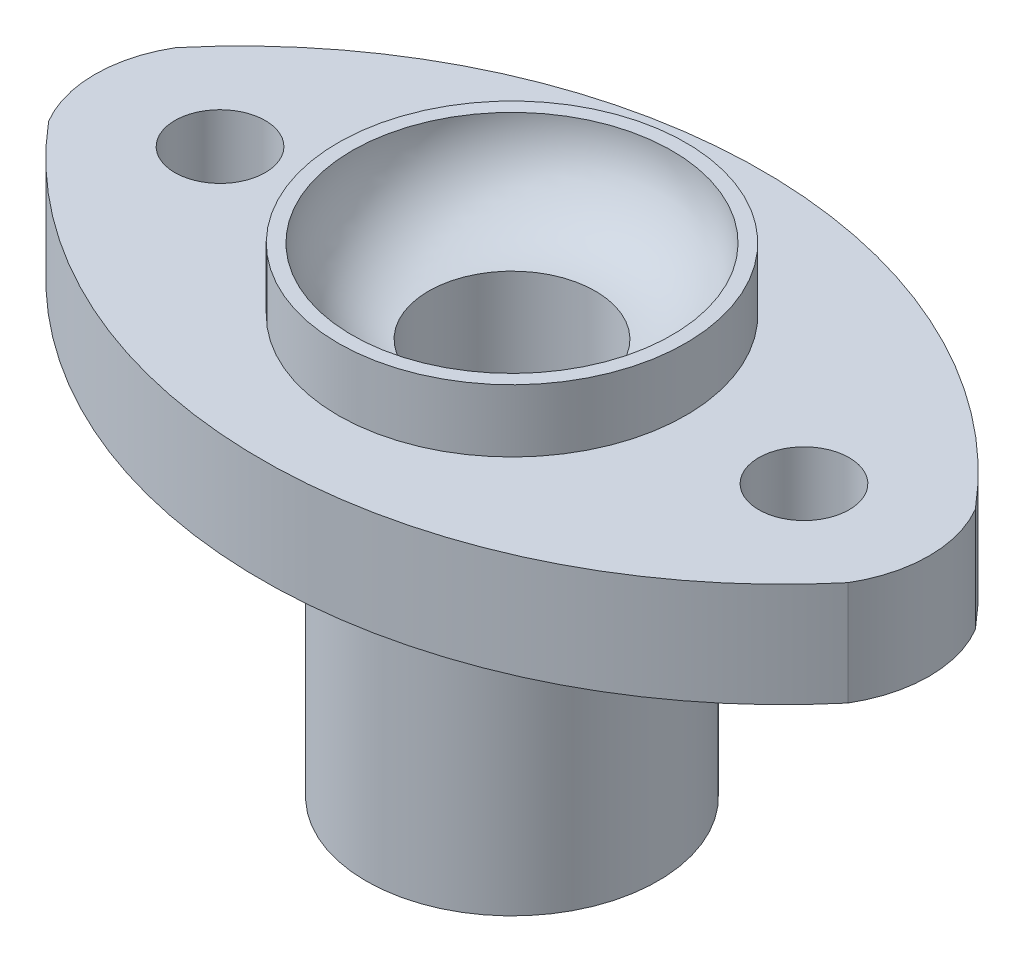
ISO-10303-21;
HEADER;
FILE_DESCRIPTION(('STEP AP214'),'2;1');
FILE_NAME('part.step','',(''),(''),'','','');
FILE_SCHEMA(('AUTOMOTIVE_DESIGN { 1 0 10303 214 1 1 1 1 }'));
ENDSEC;
DATA;
#1=APPLICATION_CONTEXT('core data for automotive mechanical design processes');
#2=APPLICATION_PROTOCOL_DEFINITION('international standard','automotive_design',2000,#1);
#3=PRODUCT_CONTEXT('',#1,'mechanical');
#4=PRODUCT('Part','Part','',(#3));
#5=PRODUCT_RELATED_PRODUCT_CATEGORY('part','',(#4));
#6=PRODUCT_DEFINITION_FORMATION('','',#4);
#7=PRODUCT_DEFINITION_CONTEXT('part definition',#1,'design');
#8=PRODUCT_DEFINITION('design','',#6,#7);
#9=PRODUCT_DEFINITION_SHAPE('','',#8);
#10=(LENGTH_UNIT() NAMED_UNIT(*) SI_UNIT(.MILLI.,.METRE.));
#11=(NAMED_UNIT(*) PLANE_ANGLE_UNIT() SI_UNIT($,.RADIAN.));
#12=(NAMED_UNIT(*) SI_UNIT($,.STERADIAN.) SOLID_ANGLE_UNIT());
#13=UNCERTAINTY_MEASURE_WITH_UNIT(LENGTH_MEASURE(1.E-05),#10,'distance_accuracy_value','');
#14=(GEOMETRIC_REPRESENTATION_CONTEXT(3) GLOBAL_UNCERTAINTY_ASSIGNED_CONTEXT((#13)) GLOBAL_UNIT_ASSIGNED_CONTEXT((#10,
#11,#12)) REPRESENTATION_CONTEXT('',''));
#15=CARTESIAN_POINT('',(0.,0.,0.));
#16=DIRECTION('',(0.,0.,1.));
#17=DIRECTION('',(1.,0.,0.));
#18=AXIS2_PLACEMENT_3D('',#15,#16,#17);
#19=CARTESIAN_POINT('',(0.,45.,0.));
#20=DIRECTION('',(0.,-1.,0.));
#21=DIRECTION('',(0.,0.,-1.));
#22=AXIS2_PLACEMENT_3D('',#19,#20,#21);
#23=CYLINDRICAL_SURFACE('',#22,21.);
#24=CARTESIAN_POINT('',(0.,45.,0.));
#25=DIRECTION('',(0.,1.,0.));
#26=DIRECTION('',(0.,0.,1.));
#27=AXIS2_PLACEMENT_3D('',#24,#25,#26);
#28=CIRCLE('',#27,21.);
#29=CARTESIAN_POINT('',(0.,45.,-21.));
#30=VERTEX_POINT('',#29);
#31=EDGE_CURVE('E133',#30,#30,#28,.T.);
#32=CARTESIAN_POINT('',(0.,0.,0.));
#33=DIRECTION('',(0.,1.,0.));
#34=DIRECTION('',(0.,0.,1.));
#35=AXIS2_PLACEMENT_3D('',#32,#33,#34);
#36=CIRCLE('',#35,21.);
#37=CARTESIAN_POINT('',(0.,0.,-21.));
#38=VERTEX_POINT('',#37);
#39=EDGE_CURVE('E132',#38,#38,#36,.T.);
#40=CARTESIAN_POINT('',(0.,45.,-21.));
#41=CARTESIAN_POINT('',(0.,44.53125,-21.));
#42=CARTESIAN_POINT('',(0.,44.0625,-21.));
#43=CARTESIAN_POINT('',(0.,43.125,-21.));
#44=CARTESIAN_POINT('',(0.,42.65625,-21.));
#45=CARTESIAN_POINT('',(0.,41.71875,-21.));
#46=CARTESIAN_POINT('',(0.,41.25,-21.));
#47=CARTESIAN_POINT('',(0.,40.3125,-21.));
#48=CARTESIAN_POINT('',(0.,39.84375,-21.));
#49=CARTESIAN_POINT('',(0.,38.90625,-21.));
#50=CARTESIAN_POINT('',(0.,38.4375,-21.));
#51=CARTESIAN_POINT('',(0.,37.5,-21.));
#52=CARTESIAN_POINT('',(0.,37.03125,-21.));
#53=CARTESIAN_POINT('',(0.,36.09375,-21.));
#54=CARTESIAN_POINT('',(0.,35.625,-21.));
#55=CARTESIAN_POINT('',(0.,34.6875,-21.));
#56=CARTESIAN_POINT('',(0.,34.21875,-21.));
#57=CARTESIAN_POINT('',(0.,33.28125,-21.));
#58=CARTESIAN_POINT('',(0.,32.8125,-21.));
#59=CARTESIAN_POINT('',(0.,31.875,-21.));
#60=CARTESIAN_POINT('',(0.,31.40625,-21.));
#61=CARTESIAN_POINT('',(0.,30.46875,-21.));
#62=CARTESIAN_POINT('',(0.,30.,-21.));
#63=CARTESIAN_POINT('',(0.,29.0625,-21.));
#64=CARTESIAN_POINT('',(0.,28.59375,-21.));
#65=CARTESIAN_POINT('',(0.,27.65625,-21.));
#66=CARTESIAN_POINT('',(0.,27.1875,-21.));
#67=CARTESIAN_POINT('',(0.,26.25,-21.));
#68=CARTESIAN_POINT('',(0.,25.78125,-21.));
#69=CARTESIAN_POINT('',(0.,24.84375,-21.));
#70=CARTESIAN_POINT('',(0.,24.375,-21.));
#71=CARTESIAN_POINT('',(0.,23.4375,-21.));
#72=CARTESIAN_POINT('',(0.,22.96875,-21.));
#73=CARTESIAN_POINT('',(0.,22.03125,-21.));
#74=CARTESIAN_POINT('',(0.,21.5625,-21.));
#75=CARTESIAN_POINT('',(0.,20.625,-21.));
#76=CARTESIAN_POINT('',(0.,20.15625,-21.));
#77=CARTESIAN_POINT('',(0.,19.21875,-21.));
#78=CARTESIAN_POINT('',(0.,18.75,-21.));
#79=CARTESIAN_POINT('',(0.,17.8125,-21.));
#80=CARTESIAN_POINT('',(0.,17.34375,-21.));
#81=CARTESIAN_POINT('',(0.,16.40625,-21.));
#82=CARTESIAN_POINT('',(0.,15.9375,-21.));
#83=CARTESIAN_POINT('',(0.,15.,-21.));
#84=CARTESIAN_POINT('',(0.,14.53125,-21.));
#85=CARTESIAN_POINT('',(0.,13.59375,-21.));
#86=CARTESIAN_POINT('',(0.,13.125,-21.));
#87=CARTESIAN_POINT('',(0.,12.1875,-21.));
#88=CARTESIAN_POINT('',(0.,11.71875,-21.));
#89=CARTESIAN_POINT('',(0.,10.78125,-21.));
#90=CARTESIAN_POINT('',(0.,10.3125,-21.));
#91=CARTESIAN_POINT('',(0.,9.375,-21.));
#92=CARTESIAN_POINT('',(0.,8.90625,-21.));
#93=CARTESIAN_POINT('',(0.,7.96874999999999,-21.));
#94=CARTESIAN_POINT('',(0.,7.5,-21.));
#95=CARTESIAN_POINT('',(0.,6.5625,-21.));
#96=CARTESIAN_POINT('',(0.,6.09375,-21.));
#97=CARTESIAN_POINT('',(0.,5.15625,-21.));
#98=CARTESIAN_POINT('',(0.,4.68749999999999,-21.));
#99=CARTESIAN_POINT('',(0.,3.74999999999999,-21.));
#100=CARTESIAN_POINT('',(0.,3.28124999999999,-21.));
#101=CARTESIAN_POINT('',(0.,2.34374999999999,-21.));
#102=CARTESIAN_POINT('',(0.,1.87499999999999,-21.));
#103=CARTESIAN_POINT('',(0.,0.937499999999992,-21.));
#104=CARTESIAN_POINT('',(0.,0.468749999999993,-21.));
#105=CARTESIAN_POINT('',(0.,0.,-21.));
#106=B_SPLINE_CURVE_WITH_KNOTS('',3,(#40,#41,#42,#43,#44,#45,#46,#47,#48,#49,#50,#51,#52,#53,
#54,#55,#56,#57,#58,#59,#60,#61,#62,#63,#64,#65,#66,#67,#68,#69,#70,#71,#72,#73,#74,#75,#76,#77,
#78,#79,#80,#81,#82,#83,#84,#85,#86,#87,#88,#89,#90,#91,#92,#93,#94,#95,#96,#97,#98,#99,#100,
#101,#102,#103,#104,#105),.UNSPECIFIED.,.F.,.F.,(4,2,2,2,2,2,2,2,2,2,2,2,2,2,2,2,2,2,2,2,2,2,2,
2,2,2,2,2,2,2,2,2,4),(0.,1.40625,2.8125,4.21875000000001,5.62500000000001,7.03125,8.4375,
9.84375000000001,11.25,12.65625,14.0625,15.46875,16.875,18.28125,19.6875,21.09375,22.5,23.90625,
25.3125,26.71875,28.125,29.53125,30.9375,32.34375,33.75,35.15625,36.5625,37.96875,39.375,
40.78125,42.1875,43.59375,45.),.UNSPECIFIED.);
#107=EDGE_CURVE('BSEAM40',#30,#38,#106,.T.);
#108=ORIENTED_EDGE('',*,*,#31,.F.);
#109=ORIENTED_EDGE('',*,*,#39,.T.);
#110=ORIENTED_EDGE('',*,*,#107,.T.);
#111=ORIENTED_EDGE('',*,*,#107,.F.);
#112=EDGE_LOOP('',(#108,#110,#109,#111));
#113=FACE_BOUND('',#112,.T.);
#114=ADVANCED_FACE('F40',(#113),#23,.T.);
#115=CARTESIAN_POINT('',(0.,0.,0.));
#116=DIRECTION('',(0.,1.,0.));
#117=DIRECTION('',(0.,0.,1.));
#118=AXIS2_PLACEMENT_3D('',#115,#116,#117);
#119=PLANE('',#118);
#120=CARTESIAN_POINT('',(0.,0.,0.));
#121=DIRECTION('',(0.,1.,0.));
#122=DIRECTION('',(0.,0.,1.));
#123=AXIS2_PLACEMENT_3D('',#120,#121,#122);
#124=CIRCLE('',#123,14.5000000000001);
#125=CARTESIAN_POINT('',(0.,0.,14.5000000000001));
#126=VERTEX_POINT('',#125);
#127=EDGE_CURVE('E11',#126,#126,#124,.T.);
#128=ORIENTED_EDGE('',*,*,#127,.T.);
#129=EDGE_LOOP('',(#128));
#130=FACE_BOUND('',#129,.T.);
#131=ORIENTED_EDGE('',*,*,#39,.F.);
#132=EDGE_LOOP('',(#131));
#133=FACE_BOUND('',#132,.T.);
#134=ADVANCED_FACE('F204',(#130,#133),#119,.F.);
#135=CARTESIAN_POINT('',(-21.,60.,-19.5));
#136=DIRECTION('',(0.,-1.,0.));
#137=DIRECTION('',(0.,0.,-1.));
#138=AXIS2_PLACEMENT_3D('',#135,#136,#137);
#139=PLANE('',#138);
#140=CARTESIAN_POINT('',(0.,60.,0.));
#141=DIRECTION('',(0.,1.,0.));
#142=DIRECTION('',(0.,0.,1.));
#143=AXIS2_PLACEMENT_3D('',#140,#141,#142);
#144=CIRCLE('',#143,25.);
#145=CARTESIAN_POINT('',(0.,60.,25.));
#146=VERTEX_POINT('',#145);
#147=EDGE_CURVE('E137',#146,#146,#144,.T.);
#148=ORIENTED_EDGE('',*,*,#147,.F.);
#149=EDGE_LOOP('',(#148));
#150=FACE_BOUND('',#149,.T.);
#151=CARTESIAN_POINT('',(0.,60.,-39.));
#152=DIRECTION('',(0.,1.,0.));
#153=DIRECTION('',(0.,0.,-1.));
#154=AXIS2_PLACEMENT_3D('',#151,#152,#153);
#155=CIRCLE('',#154,75.);
#156=CARTESIAN_POINT('',(-57.49619544665,60.,9.15794336514615));
#157=VERTEX_POINT('',#156);
#158=CARTESIAN_POINT('',(57.49619544665,60.,9.15794336514614));
#159=VERTEX_POINT('',#158);
#160=EDGE_CURVE('E96',#157,#159,#155,.T.);
#161=ORIENTED_EDGE('',*,*,#160,.T.);
#162=CARTESIAN_POINT('',(42.,60.,0.));
#163=DIRECTION('',(0.,1.,0.));
#164=DIRECTION('',(0.,0.,1.));
#165=AXIS2_PLACEMENT_3D('',#162,#163,#164);
#166=CIRCLE('',#165,18.);
#167=CARTESIAN_POINT('',(57.49619544665,60.,-9.15794336514614));
#168=VERTEX_POINT('',#167);
#169=EDGE_CURVE('E90',#159,#168,#166,.T.);
#170=ORIENTED_EDGE('',*,*,#169,.T.);
#171=CARTESIAN_POINT('',(0.,60.,39.));
#172=DIRECTION('',(0.,1.,0.));
#173=DIRECTION('',(0.,0.,1.));
#174=AXIS2_PLACEMENT_3D('',#171,#172,#173);
#175=CIRCLE('',#174,75.);
#176=CARTESIAN_POINT('',(-57.49619544665,60.,-9.15794336514612));
#177=VERTEX_POINT('',#176);
#178=EDGE_CURVE('E94',#168,#177,#175,.T.);
#179=ORIENTED_EDGE('',*,*,#178,.T.);
#180=CARTESIAN_POINT('',(-42.,60.,0.));
#181=DIRECTION('',(0.,1.,0.));
#182=DIRECTION('',(0.,0.,-1.));
#183=AXIS2_PLACEMENT_3D('',#180,#181,#182);
#184=CIRCLE('',#183,18.);
#185=EDGE_CURVE('E59',#177,#157,#184,.T.);
#186=ORIENTED_EDGE('',*,*,#185,.T.);
#187=EDGE_LOOP('',(#161,#170,#179,#186));
#188=FACE_BOUND('',#187,.T.);
#189=CARTESIAN_POINT('',(-42.,60.,0.));
#190=DIRECTION('',(0.,1.,0.));
#191=DIRECTION('',(0.,0.,1.));
#192=AXIS2_PLACEMENT_3D('',#189,#190,#191);
#193=CIRCLE('',#192,6.5);
#194=CARTESIAN_POINT('',(-42.,60.,6.5));
#195=VERTEX_POINT('',#194);
#196=EDGE_CURVE('E119',#195,#195,#193,.T.);
#197=ORIENTED_EDGE('',*,*,#196,.F.);
#198=EDGE_LOOP('',(#197));
#199=FACE_BOUND('',#198,.T.);
#200=CARTESIAN_POINT('',(42.,60.,0.));
#201=DIRECTION('',(0.,1.,0.));
#202=DIRECTION('',(0.,0.,-1.));
#203=AXIS2_PLACEMENT_3D('',#200,#201,#202);
#204=CIRCLE('',#203,6.5);
#205=CARTESIAN_POINT('',(42.,60.,-6.5));
#206=VERTEX_POINT('',#205);
#207=EDGE_CURVE('E153',#206,#206,#204,.T.);
#208=ORIENTED_EDGE('',*,*,#207,.F.);
#209=EDGE_LOOP('',(#208));
#210=FACE_BOUND('',#209,.T.);
#211=ADVANCED_FACE('F91',(#150,#188,#199,#210),#139,.F.);
#212=CARTESIAN_POINT('',(-21.,45.,-19.5));
#213=DIRECTION('',(0.,-1.,0.));
#214=DIRECTION('',(0.,0.,-1.));
#215=AXIS2_PLACEMENT_3D('',#212,#213,#214);
#216=PLANE('',#215);
#217=ORIENTED_EDGE('',*,*,#31,.T.);
#218=EDGE_LOOP('',(#217));
#219=FACE_BOUND('',#218,.T.);
#220=CARTESIAN_POINT('',(-42.,45.,0.));
#221=DIRECTION('',(0.,1.,0.));
#222=DIRECTION('',(0.,0.,1.));
#223=AXIS2_PLACEMENT_3D('',#220,#221,#222);
#224=CIRCLE('',#223,6.5);
#225=CARTESIAN_POINT('',(-42.,45.,6.5));
#226=VERTEX_POINT('',#225);
#227=EDGE_CURVE('E157',#226,#226,#224,.T.);
#228=ORIENTED_EDGE('',*,*,#227,.T.);
#229=EDGE_LOOP('',(#228));
#230=FACE_BOUND('',#229,.T.);
#231=CARTESIAN_POINT('',(0.,45.,-39.));
#232=DIRECTION('',(0.,1.,0.));
#233=DIRECTION('',(0.,0.,-1.));
#234=AXIS2_PLACEMENT_3D('',#231,#232,#233);
#235=CIRCLE('',#234,75.);
#236=CARTESIAN_POINT('',(-57.49619544665,45.,9.15794336514615));
#237=VERTEX_POINT('',#236);
#238=CARTESIAN_POINT('',(57.49619544665,45.,9.15794336514614));
#239=VERTEX_POINT('',#238);
#240=EDGE_CURVE('E115',#237,#239,#235,.T.);
#241=ORIENTED_EDGE('',*,*,#240,.F.);
#242=CARTESIAN_POINT('',(-42.,45.,0.));
#243=DIRECTION('',(0.,1.,0.));
#244=DIRECTION('',(0.,0.,-1.));
#245=AXIS2_PLACEMENT_3D('',#242,#243,#244);
#246=CIRCLE('',#245,18.);
#247=CARTESIAN_POINT('',(-57.49619544665,45.,-9.15794336514612));
#248=VERTEX_POINT('',#247);
#249=EDGE_CURVE('E82',#248,#237,#246,.T.);
#250=ORIENTED_EDGE('',*,*,#249,.F.);
#251=CARTESIAN_POINT('',(0.,45.,39.));
#252=DIRECTION('',(0.,1.,0.));
#253=DIRECTION('',(0.,0.,1.));
#254=AXIS2_PLACEMENT_3D('',#251,#252,#253);
#255=CIRCLE('',#254,75.);
#256=CARTESIAN_POINT('',(57.49619544665,45.,-9.15794336514614));
#257=VERTEX_POINT('',#256);
#258=EDGE_CURVE('E76',#257,#248,#255,.T.);
#259=ORIENTED_EDGE('',*,*,#258,.F.);
#260=CARTESIAN_POINT('',(42.,45.,0.));
#261=DIRECTION('',(0.,1.,0.));
#262=DIRECTION('',(0.,0.,1.));
#263=AXIS2_PLACEMENT_3D('',#260,#261,#262);
#264=CIRCLE('',#263,18.);
#265=EDGE_CURVE('E102',#239,#257,#264,.T.);
#266=ORIENTED_EDGE('',*,*,#265,.F.);
#267=EDGE_LOOP('',(#241,#250,#259,#266));
#268=FACE_BOUND('',#267,.T.);
#269=CARTESIAN_POINT('',(42.,45.,0.));
#270=DIRECTION('',(0.,1.,0.));
#271=DIRECTION('',(0.,0.,-1.));
#272=AXIS2_PLACEMENT_3D('',#269,#270,#271);
#273=CIRCLE('',#272,6.5);
#274=CARTESIAN_POINT('',(42.,45.,-6.5));
#275=VERTEX_POINT('',#274);
#276=EDGE_CURVE('E158',#275,#275,#273,.T.);
#277=ORIENTED_EDGE('',*,*,#276,.T.);
#278=EDGE_LOOP('',(#277));
#279=FACE_BOUND('',#278,.T.);
#280=ADVANCED_FACE('F217',(#219,#230,#268,#279),#216,.T.);
#281=CARTESIAN_POINT('',(0.,60.,-39.));
#282=DIRECTION('',(0.,-1.,0.));
#283=DIRECTION('',(0.,0.,-1.));
#284=AXIS2_PLACEMENT_3D('',#281,#282,#283);
#285=CYLINDRICAL_SURFACE('',#284,75.);
#286=ORIENTED_EDGE('',*,*,#240,.T.);
#287=DIRECTION('',(0.,-1.,0.));
#288=VECTOR('',#287,1.);
#289=CARTESIAN_POINT('',(57.49619544665,60.,9.15794336514614));
#290=LINE('',#289,#288);
#291=EDGE_CURVE('E104',#159,#239,#290,.T.);
#292=ORIENTED_EDGE('',*,*,#291,.F.);
#293=ORIENTED_EDGE('',*,*,#160,.F.);
#294=DIRECTION('',(0.,-1.,0.));
#295=VECTOR('',#294,1.);
#296=CARTESIAN_POINT('',(-57.49619544665,60.,9.15794336514615));
#297=LINE('',#296,#295);
#298=EDGE_CURVE('E111',#157,#237,#297,.T.);
#299=ORIENTED_EDGE('',*,*,#298,.T.);
#300=EDGE_LOOP('',(#286,#292,#293,#299));
#301=FACE_BOUND('',#300,.T.);
#302=ADVANCED_FACE('F214',(#301),#285,.T.);
#303=CARTESIAN_POINT('',(42.,60.,0.));
#304=DIRECTION('',(0.,-1.,0.));
#305=DIRECTION('',(0.,0.,-1.));
#306=AXIS2_PLACEMENT_3D('',#303,#304,#305);
#307=CYLINDRICAL_SURFACE('',#306,18.);
#308=ORIENTED_EDGE('',*,*,#265,.T.);
#309=DIRECTION('',(0.,-1.,0.));
#310=VECTOR('',#309,1.);
#311=CARTESIAN_POINT('',(57.49619544665,60.,-9.15794336514614));
#312=LINE('',#311,#310);
#313=EDGE_CURVE('E100',#168,#257,#312,.T.);
#314=ORIENTED_EDGE('',*,*,#313,.F.);
#315=ORIENTED_EDGE('',*,*,#169,.F.);
#316=ORIENTED_EDGE('',*,*,#291,.T.);
#317=EDGE_LOOP('',(#308,#314,#315,#316));
#318=FACE_BOUND('',#317,.T.);
#319=ADVANCED_FACE('F101',(#318),#307,.T.);
#320=CARTESIAN_POINT('',(0.,60.,39.));
#321=DIRECTION('',(0.,-1.,0.));
#322=DIRECTION('',(0.,0.,-1.));
#323=AXIS2_PLACEMENT_3D('',#320,#321,#322);
#324=CYLINDRICAL_SURFACE('',#323,75.);
#325=ORIENTED_EDGE('',*,*,#258,.T.);
#326=DIRECTION('',(0.,-1.,0.));
#327=VECTOR('',#326,1.);
#328=CARTESIAN_POINT('',(-57.49619544665,60.,-9.15794336514612));
#329=LINE('',#328,#327);
#330=EDGE_CURVE('E105',#177,#248,#329,.T.);
#331=ORIENTED_EDGE('',*,*,#330,.F.);
#332=ORIENTED_EDGE('',*,*,#178,.F.);
#333=ORIENTED_EDGE('',*,*,#313,.T.);
#334=EDGE_LOOP('',(#325,#331,#332,#333));
#335=FACE_BOUND('',#334,.T.);
#336=ADVANCED_FACE('F107',(#335),#324,.T.);
#337=CARTESIAN_POINT('',(-42.,60.,0.));
#338=DIRECTION('',(0.,-1.,0.));
#339=DIRECTION('',(0.,0.,-1.));
#340=AXIS2_PLACEMENT_3D('',#337,#338,#339);
#341=CYLINDRICAL_SURFACE('',#340,18.);
#342=ORIENTED_EDGE('',*,*,#249,.T.);
#343=ORIENTED_EDGE('',*,*,#298,.F.);
#344=ORIENTED_EDGE('',*,*,#185,.F.);
#345=ORIENTED_EDGE('',*,*,#330,.T.);
#346=EDGE_LOOP('',(#342,#343,#344,#345));
#347=FACE_BOUND('',#346,.T.);
#348=ADVANCED_FACE('F223',(#347),#341,.T.);
#349=CARTESIAN_POINT('',(-42.,60.,0.));
#350=DIRECTION('',(0.,-1.,0.));
#351=DIRECTION('',(0.,0.,-1.));
#352=AXIS2_PLACEMENT_3D('',#349,#350,#351);
#353=CYLINDRICAL_SURFACE('',#352,6.5);
#354=ORIENTED_EDGE('',*,*,#196,.T.);
#355=EDGE_LOOP('',(#354));
#356=FACE_BOUND('',#355,.T.);
#357=ORIENTED_EDGE('',*,*,#227,.F.);
#358=EDGE_LOOP('',(#357));
#359=FACE_BOUND('',#358,.T.);
#360=ADVANCED_FACE('F200',(#356,#359),#353,.F.);
#361=CARTESIAN_POINT('',(42.,60.,0.));
#362=DIRECTION('',(0.,-1.,0.));
#363=DIRECTION('',(0.,0.,-1.));
#364=AXIS2_PLACEMENT_3D('',#361,#362,#363);
#365=CYLINDRICAL_SURFACE('',#364,6.5);
#366=ORIENTED_EDGE('',*,*,#207,.T.);
#367=EDGE_LOOP('',(#366));
#368=FACE_BOUND('',#367,.T.);
#369=ORIENTED_EDGE('',*,*,#276,.F.);
#370=EDGE_LOOP('',(#369));
#371=FACE_BOUND('',#370,.T.);
#372=ADVANCED_FACE('F195',(#368,#371),#365,.F.);
#373=CARTESIAN_POINT('',(0.,69.,0.));
#374=DIRECTION('',(0.,-1.,0.));
#375=DIRECTION('',(0.,0.,-1.));
#376=AXIS2_PLACEMENT_3D('',#373,#374,#375);
#377=CYLINDRICAL_SURFACE('',#376,25.);
#378=CARTESIAN_POINT('',(0.,69.,0.));
#379=DIRECTION('',(0.,1.,0.));
#380=DIRECTION('',(0.,0.,1.));
#381=AXIS2_PLACEMENT_3D('',#378,#379,#380);
#382=CIRCLE('',#381,25.);
#383=CARTESIAN_POINT('',(0.,69.,25.));
#384=VERTEX_POINT('',#383);
#385=EDGE_CURVE('E151',#384,#384,#382,.T.);
#386=ORIENTED_EDGE('',*,*,#385,.F.);
#387=EDGE_LOOP('',(#386));
#388=FACE_BOUND('',#387,.T.);
#389=ORIENTED_EDGE('',*,*,#147,.T.);
#390=EDGE_LOOP('',(#389));
#391=FACE_BOUND('',#390,.T.);
#392=ADVANCED_FACE('F190',(#388,#391),#377,.T.);
#393=CARTESIAN_POINT('',(0.,69.,0.));
#394=DIRECTION('',(0.,1.,0.));
#395=DIRECTION('',(0.,0.,1.));
#396=AXIS2_PLACEMENT_3D('',#393,#394,#395);
#397=PLANE('',#396);
#398=CARTESIAN_POINT('',(0.,69.,0.));
#399=DIRECTION('',(0.,1.,0.));
#400=DIRECTION('',(-1.,0.,0.));
#401=AXIS2_PLACEMENT_3D('',#398,#399,#400);
#402=CIRCLE('',#401,23.);
#403=CARTESIAN_POINT('',(-23.,69.,0.));
#404=VERTEX_POINT('',#403);
#405=EDGE_CURVE('E171',#404,#404,#402,.T.);
#406=ORIENTED_EDGE('',*,*,#405,.F.);
#407=EDGE_LOOP('',(#406));
#408=FACE_BOUND('',#407,.T.);
#409=ORIENTED_EDGE('',*,*,#385,.T.);
#410=EDGE_LOOP('',(#409));
#411=FACE_BOUND('',#410,.T.);
#412=ADVANCED_FACE('F184',(#408,#411),#397,.T.);
#413=CARTESIAN_POINT('',(0.,68.9582668114332,0.));
#414=DIRECTION('',(0.,1.,0.));
#415=DIRECTION('',(-1.,0.,0.));
#416=AXIS2_PLACEMENT_3D('',#413,#414,#415);
#417=DEGENERATE_TOROIDAL_SURFACE('',#416,11.0000725693456,12.,.T.);
#418=CARTESIAN_POINT('',(0.,57.,0.));
#419=DIRECTION('',(0.,1.,0.));
#420=DIRECTION('',(-1.,0.,0.));
#421=AXIS2_PLACEMENT_3D('',#418,#419,#420);
#422=CIRCLE('',#421,12.);
#423=CARTESIAN_POINT('',(-12.,57.,0.));
#424=VERTEX_POINT('',#423);
#425=EDGE_CURVE('E174',#424,#424,#422,.T.);
#426=ORIENTED_EDGE('',*,*,#425,.F.);
#427=EDGE_LOOP('',(#426));
#428=FACE_BOUND('',#427,.T.);
#429=ORIENTED_EDGE('',*,*,#405,.T.);
#430=EDGE_LOOP('',(#429));
#431=FACE_BOUND('',#430,.T.);
#432=ADVANCED_FACE('F181',(#428,#431),#417,.F.);
#433=CARTESIAN_POINT('',(0.,-0.00100000000000794,0.));
#434=DIRECTION('',(0.,1.,0.));
#435=DIRECTION('',(-1.,0.,0.));
#436=AXIS2_PLACEMENT_3D('',#433,#434,#435);
#437=CYLINDRICAL_SURFACE('',#436,12.);
#438=CARTESIAN_POINT('',(0.,0.669872981077811,0.));
#439=DIRECTION('',(0.,1.,0.));
#440=DIRECTION('',(-1.,0.,0.));
#441=AXIS2_PLACEMENT_3D('',#438,#439,#440);
#442=CIRCLE('',#441,12.);
#443=CARTESIAN_POINT('',(-12.,0.66987298107781,0.));
#444=VERTEX_POINT('',#443);
#445=EDGE_CURVE('E51',#444,#444,#442,.F.);
#446=ORIENTED_EDGE('',*,*,#445,.T.);
#447=EDGE_LOOP('',(#446));
#448=FACE_BOUND('',#447,.T.);
#449=ORIENTED_EDGE('',*,*,#425,.T.);
#450=EDGE_LOOP('',(#449));
#451=FACE_BOUND('',#450,.T.);
#452=ADVANCED_FACE('F179',(#448,#451),#437,.F.);
#453=CARTESIAN_POINT('',(0.,0.669872981077811,0.));
#454=DIRECTION('',(0.,-1.,0.));
#455=DIRECTION('',(1.,0.,0.));
#456=AXIS2_PLACEMENT_3D('',#453,#454,#455);
#457=CONICAL_SURFACE('',#456,12.,1.30899693899575);
#458=ORIENTED_EDGE('',*,*,#127,.F.);
#459=EDGE_LOOP('',(#458));
#460=FACE_BOUND('',#459,.T.);
#461=ORIENTED_EDGE('',*,*,#445,.F.);
#462=EDGE_LOOP('',(#461));
#463=FACE_BOUND('',#462,.T.);
#464=ADVANCED_FACE('F43',(#460,#463),#457,.F.);
#465=CLOSED_SHELL('',(#114,#134,#211,#280,#302,#319,#336,#348,#360,#372,#392,#412,#432,#452,#464));
#466=MANIFOLD_SOLID_BREP('B2',#465);
#467=ADVANCED_BREP_SHAPE_REPRESENTATION('',(#18,#466),#14);
#468=SHAPE_DEFINITION_REPRESENTATION(#9,#467);
ENDSEC;
END-ISO-10303-21;
